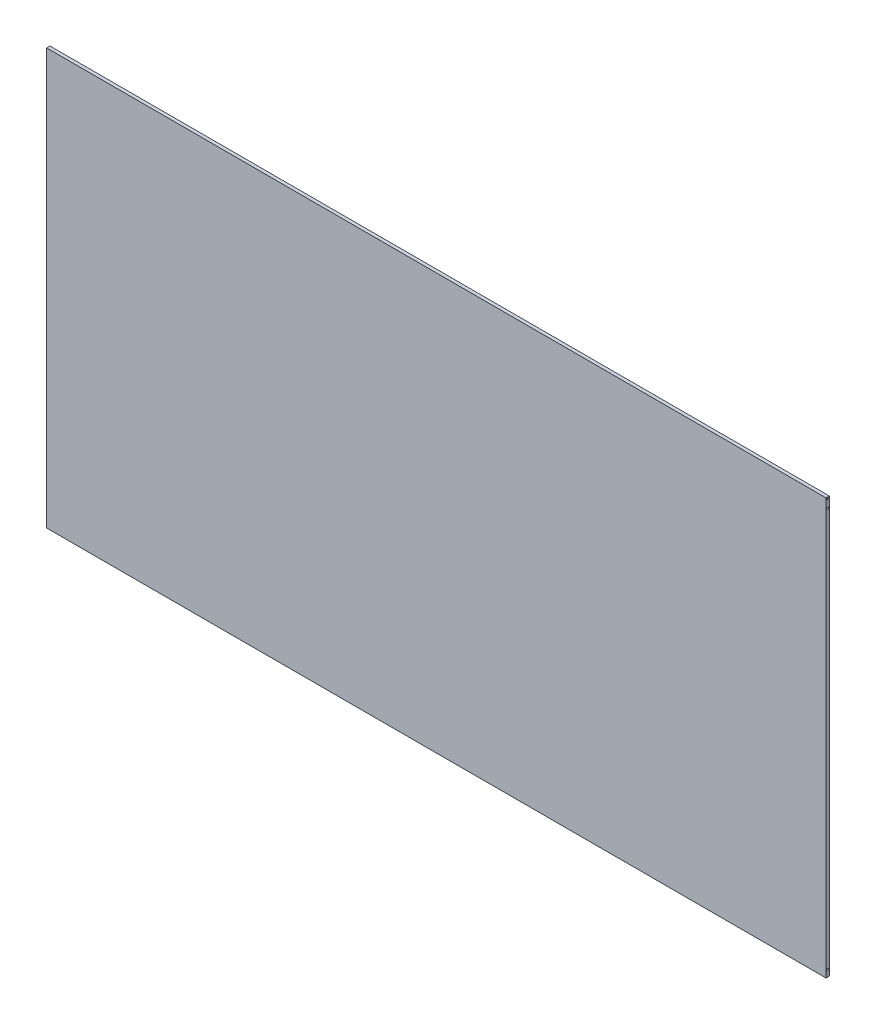
ISO-10303-21;
HEADER;
FILE_DESCRIPTION(('STEP AP214'),'2;1');
FILE_NAME('part.step','',(''),(''),'','','');
FILE_SCHEMA(('AUTOMOTIVE_DESIGN { 1 0 10303 214 1 1 1 1 }'));
ENDSEC;
DATA;
#1=APPLICATION_CONTEXT('core data for automotive mechanical design processes');
#2=APPLICATION_PROTOCOL_DEFINITION('international standard','automotive_design',2000,#1);
#3=PRODUCT_CONTEXT('',#1,'mechanical');
#4=PRODUCT('Part','Part','',(#3));
#5=PRODUCT_RELATED_PRODUCT_CATEGORY('part','',(#4));
#6=PRODUCT_DEFINITION_FORMATION('','',#4);
#7=PRODUCT_DEFINITION_CONTEXT('part definition',#1,'design');
#8=PRODUCT_DEFINITION('design','',#6,#7);
#9=PRODUCT_DEFINITION_SHAPE('','',#8);
#10=(LENGTH_UNIT() NAMED_UNIT(*) SI_UNIT(.MILLI.,.METRE.));
#11=(NAMED_UNIT(*) PLANE_ANGLE_UNIT() SI_UNIT($,.RADIAN.));
#12=(NAMED_UNIT(*) SI_UNIT($,.STERADIAN.) SOLID_ANGLE_UNIT());
#13=UNCERTAINTY_MEASURE_WITH_UNIT(LENGTH_MEASURE(1.E-05),#10,'distance_accuracy_value','');
#14=(GEOMETRIC_REPRESENTATION_CONTEXT(3) GLOBAL_UNCERTAINTY_ASSIGNED_CONTEXT((#13)) GLOBAL_UNIT_ASSIGNED_CONTEXT((#10,
#11,#12)) REPRESENTATION_CONTEXT('',''));
#15=CARTESIAN_POINT('',(0.,0.,0.));
#16=DIRECTION('',(0.,0.,1.));
#17=DIRECTION('',(1.,0.,0.));
#18=AXIS2_PLACEMENT_3D('',#15,#16,#17);
#19=CARTESIAN_POINT('',(595.,317.5,4.99999999999989));
#20=DIRECTION('',(-1.,0.,0.));
#21=DIRECTION('',(0.,0.,1.));
#22=AXIS2_PLACEMENT_3D('',#19,#20,#21);
#23=PLANE('',#22);
#24=CARTESIAN_POINT('',(595.,315.000000000002,2.50000000000017));
#25=DIRECTION('',(1.,0.,0.));
#26=DIRECTION('',(0.,0.,-1.));
#27=AXIS2_PLACEMENT_3D('',#24,#25,#26);
#28=CIRCLE('',#27,1.20000000000014);
#29=CARTESIAN_POINT('',(595.,315.000000000002,1.30000000000003));
#30=VERTEX_POINT('',#29);
#31=EDGE_CURVE('E138',#30,#30,#28,.T.);
#32=ORIENTED_EDGE('',*,*,#31,.F.);
#33=EDGE_LOOP('',(#32));
#34=FACE_BOUND('',#33,.T.);
#35=CARTESIAN_POINT('',(595.,302.500000000003,2.4999999999995));
#36=DIRECTION('',(1.,0.,0.));
#37=DIRECTION('',(0.,0.,-1.));
#38=AXIS2_PLACEMENT_3D('',#35,#36,#37);
#39=CIRCLE('',#38,1.5);
#40=CARTESIAN_POINT('',(595.,302.500000000003,0.999999999999499));
#41=VERTEX_POINT('',#40);
#42=EDGE_CURVE('E133',#41,#41,#39,.T.);
#43=ORIENTED_EDGE('',*,*,#42,.F.);
#44=EDGE_LOOP('',(#43));
#45=FACE_BOUND('',#44,.T.);
#46=CARTESIAN_POINT('',(595.,-307.499999999998,2.49999999999906));
#47=DIRECTION('',(1.,0.,0.));
#48=DIRECTION('',(0.,0.,-1.));
#49=AXIS2_PLACEMENT_3D('',#46,#47,#48);
#50=CIRCLE('',#49,1.49999999999997);
#51=CARTESIAN_POINT('',(595.,-307.499999999998,0.99999999999909));
#52=VERTEX_POINT('',#51);
#53=EDGE_CURVE('E129',#52,#52,#50,.T.);
#54=ORIENTED_EDGE('',*,*,#53,.F.);
#55=EDGE_LOOP('',(#54));
#56=FACE_BOUND('',#55,.T.);
#57=DIRECTION('',(0.,1.,0.));
#58=VECTOR('',#57,1.);
#59=CARTESIAN_POINT('',(595.,317.5,0.));
#60=LINE('',#59,#58);
#61=CARTESIAN_POINT('',(595.,-317.5,0.));
#62=VERTEX_POINT('',#61);
#63=CARTESIAN_POINT('',(595.,317.5,0.));
#64=VERTEX_POINT('',#63);
#65=EDGE_CURVE('E106',#62,#64,#60,.T.);
#66=ORIENTED_EDGE('',*,*,#65,.T.);
#67=DIRECTION('',(0.,0.,-1.));
#68=VECTOR('',#67,1.);
#69=CARTESIAN_POINT('',(595.,317.5,4.99999999999989));
#70=LINE('',#69,#68);
#71=CARTESIAN_POINT('',(595.,317.5,4.99999999999989));
#72=VERTEX_POINT('',#71);
#73=EDGE_CURVE('E11',#72,#64,#70,.T.);
#74=ORIENTED_EDGE('',*,*,#73,.F.);
#75=DIRECTION('',(0.,1.,0.));
#76=VECTOR('',#75,1.);
#77=CARTESIAN_POINT('',(595.,317.5,4.99999999999989));
#78=LINE('',#77,#76);
#79=CARTESIAN_POINT('',(595.,-317.5,4.99999999999989));
#80=VERTEX_POINT('',#79);
#81=EDGE_CURVE('E94',#80,#72,#78,.T.);
#82=ORIENTED_EDGE('',*,*,#81,.F.);
#83=DIRECTION('',(0.,0.,-1.));
#84=VECTOR('',#83,1.);
#85=CARTESIAN_POINT('',(595.,-317.5,4.99999999999989));
#86=LINE('',#85,#84);
#87=EDGE_CURVE('E102',#80,#62,#86,.T.);
#88=ORIENTED_EDGE('',*,*,#87,.T.);
#89=EDGE_LOOP('',(#66,#74,#82,#88));
#90=FACE_BOUND('',#89,.T.);
#91=ADVANCED_FACE('F43',(#34,#45,#56,#90),#23,.F.);
#92=CARTESIAN_POINT('',(-595.,317.5,4.99999999999989));
#93=DIRECTION('',(0.,-1.,0.));
#94=DIRECTION('',(0.,0.,-1.));
#95=AXIS2_PLACEMENT_3D('',#92,#93,#94);
#96=PLANE('',#95);
#97=DIRECTION('',(-1.,0.,0.));
#98=VECTOR('',#97,1.);
#99=CARTESIAN_POINT('',(-595.,317.5,0.));
#100=LINE('',#99,#98);
#101=CARTESIAN_POINT('',(-595.,317.5,0.));
#102=VERTEX_POINT('',#101);
#103=EDGE_CURVE('E98',#64,#102,#100,.T.);
#104=ORIENTED_EDGE('',*,*,#103,.T.);
#105=DIRECTION('',(0.,0.,-1.));
#106=VECTOR('',#105,1.);
#107=CARTESIAN_POINT('',(-595.,317.5,4.99999999999989));
#108=LINE('',#107,#106);
#109=CARTESIAN_POINT('',(-595.,317.5,4.99999999999989));
#110=VERTEX_POINT('',#109);
#111=EDGE_CURVE('E51',#110,#102,#108,.T.);
#112=ORIENTED_EDGE('',*,*,#111,.F.);
#113=DIRECTION('',(-1.,0.,0.));
#114=VECTOR('',#113,1.);
#115=CARTESIAN_POINT('',(-595.,317.5,4.99999999999989));
#116=LINE('',#115,#114);
#117=EDGE_CURVE('E89',#72,#110,#116,.T.);
#118=ORIENTED_EDGE('',*,*,#117,.F.);
#119=ORIENTED_EDGE('',*,*,#73,.T.);
#120=EDGE_LOOP('',(#104,#112,#118,#119));
#121=FACE_BOUND('',#120,.T.);
#122=ADVANCED_FACE('F97',(#121),#96,.F.);
#123=CARTESIAN_POINT('',(-595.,317.5,4.99999999999989));
#124=DIRECTION('',(1.,0.,0.));
#125=DIRECTION('',(0.,0.,-1.));
#126=AXIS2_PLACEMENT_3D('',#123,#124,#125);
#127=PLANE('',#126);
#128=CARTESIAN_POINT('',(-595.,302.500000000002,2.49999999999906));
#129=DIRECTION('',(-1.,0.,0.));
#130=DIRECTION('',(0.,0.,1.));
#131=AXIS2_PLACEMENT_3D('',#128,#129,#130);
#132=CIRCLE('',#131,1.50000000000001);
#133=CARTESIAN_POINT('',(-595.,302.500000000002,3.99999999999907));
#134=VERTEX_POINT('',#133);
#135=EDGE_CURVE('E109',#134,#134,#132,.T.);
#136=ORIENTED_EDGE('',*,*,#135,.F.);
#137=EDGE_LOOP('',(#136));
#138=FACE_BOUND('',#137,.T.);
#139=DIRECTION('',(0.,-1.,0.));
#140=VECTOR('',#139,1.);
#141=CARTESIAN_POINT('',(-595.,317.5,0.));
#142=LINE('',#141,#140);
#143=CARTESIAN_POINT('',(-595.,-317.5,0.));
#144=VERTEX_POINT('',#143);
#145=EDGE_CURVE('E76',#102,#144,#142,.T.);
#146=ORIENTED_EDGE('',*,*,#145,.T.);
#147=DIRECTION('',(0.,0.,-1.));
#148=VECTOR('',#147,1.);
#149=CARTESIAN_POINT('',(-595.,-317.5,4.99999999999989));
#150=LINE('',#149,#148);
#151=CARTESIAN_POINT('',(-595.,-317.5,4.99999999999989));
#152=VERTEX_POINT('',#151);
#153=EDGE_CURVE('E99',#152,#144,#150,.T.);
#154=ORIENTED_EDGE('',*,*,#153,.F.);
#155=DIRECTION('',(0.,-1.,0.));
#156=VECTOR('',#155,1.);
#157=CARTESIAN_POINT('',(-595.,317.5,4.99999999999989));
#158=LINE('',#157,#156);
#159=EDGE_CURVE('E92',#110,#152,#158,.T.);
#160=ORIENTED_EDGE('',*,*,#159,.F.);
#161=ORIENTED_EDGE('',*,*,#111,.T.);
#162=EDGE_LOOP('',(#146,#154,#160,#161));
#163=FACE_BOUND('',#162,.T.);
#164=ADVANCED_FACE('F100',(#138,#163),#127,.F.);
#165=CARTESIAN_POINT('',(-595.,-317.5,4.99999999999989));
#166=DIRECTION('',(0.,1.,0.));
#167=DIRECTION('',(0.,0.,1.));
#168=AXIS2_PLACEMENT_3D('',#165,#166,#167);
#169=PLANE('',#168);
#170=DIRECTION('',(1.,0.,0.));
#171=VECTOR('',#170,1.);
#172=CARTESIAN_POINT('',(-595.,-317.5,0.));
#173=LINE('',#172,#171);
#174=EDGE_CURVE('E82',#144,#62,#173,.T.);
#175=ORIENTED_EDGE('',*,*,#174,.T.);
#176=ORIENTED_EDGE('',*,*,#87,.F.);
#177=DIRECTION('',(1.,0.,0.));
#178=VECTOR('',#177,1.);
#179=CARTESIAN_POINT('',(-595.,-317.5,4.99999999999989));
#180=LINE('',#179,#178);
#181=EDGE_CURVE('E59',#152,#80,#180,.T.);
#182=ORIENTED_EDGE('',*,*,#181,.F.);
#183=ORIENTED_EDGE('',*,*,#153,.T.);
#184=EDGE_LOOP('',(#175,#176,#182,#183));
#185=FACE_BOUND('',#184,.T.);
#186=ADVANCED_FACE('F114',(#185),#169,.F.);
#187=CARTESIAN_POINT('',(0.,0.,4.99999999999989));
#188=DIRECTION('',(0.,0.,1.));
#189=DIRECTION('',(1.,0.,0.));
#190=AXIS2_PLACEMENT_3D('',#187,#188,#189);
#191=PLANE('',#190);
#192=ORIENTED_EDGE('',*,*,#81,.T.);
#193=ORIENTED_EDGE('',*,*,#117,.T.);
#194=ORIENTED_EDGE('',*,*,#159,.T.);
#195=ORIENTED_EDGE('',*,*,#181,.T.);
#196=EDGE_LOOP('',(#192,#193,#194,#195));
#197=FACE_BOUND('',#196,.T.);
#198=ADVANCED_FACE('F90',(#197),#191,.T.);
#199=CARTESIAN_POINT('',(0.,0.,0.));
#200=DIRECTION('',(0.,0.,1.));
#201=DIRECTION('',(1.,0.,0.));
#202=AXIS2_PLACEMENT_3D('',#199,#200,#201);
#203=PLANE('',#202);
#204=ORIENTED_EDGE('',*,*,#65,.F.);
#205=ORIENTED_EDGE('',*,*,#174,.F.);
#206=ORIENTED_EDGE('',*,*,#145,.F.);
#207=ORIENTED_EDGE('',*,*,#103,.F.);
#208=EDGE_LOOP('',(#204,#205,#206,#207));
#209=FACE_BOUND('',#208,.T.);
#210=ADVANCED_FACE('F117',(#209),#203,.F.);
#211=CARTESIAN_POINT('',(-585.,302.500000000002,2.49999999999906));
#212=DIRECTION('',(-1.,0.,0.));
#213=DIRECTION('',(0.,0.,1.));
#214=AXIS2_PLACEMENT_3D('',#211,#212,#213);
#215=CYLINDRICAL_SURFACE('',#214,1.50000000000001);
#216=CARTESIAN_POINT('',(-585.,302.500000000002,2.49999999999906));
#217=DIRECTION('',(-1.,0.,0.));
#218=DIRECTION('',(0.,0.,1.));
#219=AXIS2_PLACEMENT_3D('',#216,#217,#218);
#220=CIRCLE('',#219,1.50000000000001);
#221=CARTESIAN_POINT('',(-585.,302.500000000002,3.99999999999907));
#222=VERTEX_POINT('',#221);
#223=EDGE_CURVE('E120',#222,#222,#220,.T.);
#224=ORIENTED_EDGE('',*,*,#223,.F.);
#225=EDGE_LOOP('',(#224));
#226=FACE_BOUND('',#225,.T.);
#227=ORIENTED_EDGE('',*,*,#135,.T.);
#228=EDGE_LOOP('',(#227));
#229=FACE_BOUND('',#228,.T.);
#230=ADVANCED_FACE('F173',(#226,#229),#215,.F.);
#231=CARTESIAN_POINT('',(-585.,302.500000000002,2.49999999999906));
#232=DIRECTION('',(-1.,0.,0.));
#233=DIRECTION('',(0.,0.,1.));
#234=AXIS2_PLACEMENT_3D('',#231,#232,#233);
#235=PLANE('',#234);
#236=ORIENTED_EDGE('',*,*,#223,.T.);
#237=EDGE_LOOP('',(#236));
#238=FACE_BOUND('',#237,.T.);
#239=ADVANCED_FACE('F162',(#238),#235,.T.);
#240=CARTESIAN_POINT('',(585.,-307.499999999998,2.49999999999906));
#241=DIRECTION('',(1.,0.,0.));
#242=DIRECTION('',(0.,0.,-1.));
#243=AXIS2_PLACEMENT_3D('',#240,#241,#242);
#244=CYLINDRICAL_SURFACE('',#243,1.49999999999997);
#245=CARTESIAN_POINT('',(585.,-307.499999999998,2.49999999999906));
#246=DIRECTION('',(1.,0.,0.));
#247=DIRECTION('',(0.,0.,-1.));
#248=AXIS2_PLACEMENT_3D('',#245,#246,#247);
#249=CIRCLE('',#248,1.49999999999997);
#250=CARTESIAN_POINT('',(585.,-307.499999999998,0.99999999999909));
#251=VERTEX_POINT('',#250);
#252=EDGE_CURVE('E126',#251,#251,#249,.T.);
#253=ORIENTED_EDGE('',*,*,#252,.F.);
#254=EDGE_LOOP('',(#253));
#255=FACE_BOUND('',#254,.T.);
#256=ORIENTED_EDGE('',*,*,#53,.T.);
#257=EDGE_LOOP('',(#256));
#258=FACE_BOUND('',#257,.T.);
#259=ADVANCED_FACE('F159',(#255,#258),#244,.F.);
#260=CARTESIAN_POINT('',(585.,-307.499999999998,2.49999999999906));
#261=DIRECTION('',(1.,0.,0.));
#262=DIRECTION('',(0.,0.,-1.));
#263=AXIS2_PLACEMENT_3D('',#260,#261,#262);
#264=PLANE('',#263);
#265=ORIENTED_EDGE('',*,*,#252,.T.);
#266=EDGE_LOOP('',(#265));
#267=FACE_BOUND('',#266,.T.);
#268=ADVANCED_FACE('F161',(#267),#264,.T.);
#269=CARTESIAN_POINT('',(585.,302.500000000003,2.4999999999995));
#270=DIRECTION('',(1.,0.,0.));
#271=DIRECTION('',(0.,0.,-1.));
#272=AXIS2_PLACEMENT_3D('',#269,#270,#271);
#273=CYLINDRICAL_SURFACE('',#272,1.5);
#274=CARTESIAN_POINT('',(585.,302.500000000003,2.4999999999995));
#275=DIRECTION('',(1.,0.,0.));
#276=DIRECTION('',(0.,0.,-1.));
#277=AXIS2_PLACEMENT_3D('',#274,#275,#276);
#278=CIRCLE('',#277,1.5);
#279=CARTESIAN_POINT('',(585.,302.500000000003,0.999999999999499));
#280=VERTEX_POINT('',#279);
#281=EDGE_CURVE('E123',#280,#280,#278,.T.);
#282=ORIENTED_EDGE('',*,*,#281,.F.);
#283=EDGE_LOOP('',(#282));
#284=FACE_BOUND('',#283,.T.);
#285=ORIENTED_EDGE('',*,*,#42,.T.);
#286=EDGE_LOOP('',(#285));
#287=FACE_BOUND('',#286,.T.);
#288=ADVANCED_FACE('F170',(#284,#287),#273,.F.);
#289=CARTESIAN_POINT('',(585.,302.500000000003,2.4999999999995));
#290=DIRECTION('',(1.,0.,0.));
#291=DIRECTION('',(0.,0.,-1.));
#292=AXIS2_PLACEMENT_3D('',#289,#290,#291);
#293=PLANE('',#292);
#294=ORIENTED_EDGE('',*,*,#281,.T.);
#295=EDGE_LOOP('',(#294));
#296=FACE_BOUND('',#295,.T.);
#297=ADVANCED_FACE('F149',(#296),#293,.T.);
#298=CARTESIAN_POINT('',(585.,315.000000000002,2.50000000000017));
#299=DIRECTION('',(1.,0.,0.));
#300=DIRECTION('',(0.,0.,-1.));
#301=AXIS2_PLACEMENT_3D('',#298,#299,#300);
#302=CYLINDRICAL_SURFACE('',#301,1.20000000000014);
#303=CARTESIAN_POINT('',(585.,315.000000000002,2.50000000000017));
#304=DIRECTION('',(1.,0.,0.));
#305=DIRECTION('',(0.,0.,-1.));
#306=AXIS2_PLACEMENT_3D('',#303,#304,#305);
#307=CIRCLE('',#306,1.20000000000014);
#308=CARTESIAN_POINT('',(585.,315.000000000002,1.30000000000003));
#309=VERTEX_POINT('',#308);
#310=EDGE_CURVE('E130',#309,#309,#307,.T.);
#311=ORIENTED_EDGE('',*,*,#310,.F.);
#312=EDGE_LOOP('',(#311));
#313=FACE_BOUND('',#312,.T.);
#314=ORIENTED_EDGE('',*,*,#31,.T.);
#315=EDGE_LOOP('',(#314));
#316=FACE_BOUND('',#315,.T.);
#317=ADVANCED_FACE('F146',(#313,#316),#302,.F.);
#318=CARTESIAN_POINT('',(585.,315.000000000002,2.50000000000017));
#319=DIRECTION('',(1.,0.,0.));
#320=DIRECTION('',(0.,0.,-1.));
#321=AXIS2_PLACEMENT_3D('',#318,#319,#320);
#322=PLANE('',#321);
#323=ORIENTED_EDGE('',*,*,#310,.T.);
#324=EDGE_LOOP('',(#323));
#325=FACE_BOUND('',#324,.T.);
#326=ADVANCED_FACE('F144',(#325),#322,.T.);
#327=CLOSED_SHELL('',(#91,#122,#164,#186,#198,#210,#230,#239,#259,#268,#288,#297,#317,#326));
#328=MANIFOLD_SOLID_BREP('B2',#327);
#329=ADVANCED_BREP_SHAPE_REPRESENTATION('',(#18,#328),#14);
#330=SHAPE_DEFINITION_REPRESENTATION(#9,#329);
ENDSEC;
END-ISO-10303-21;
